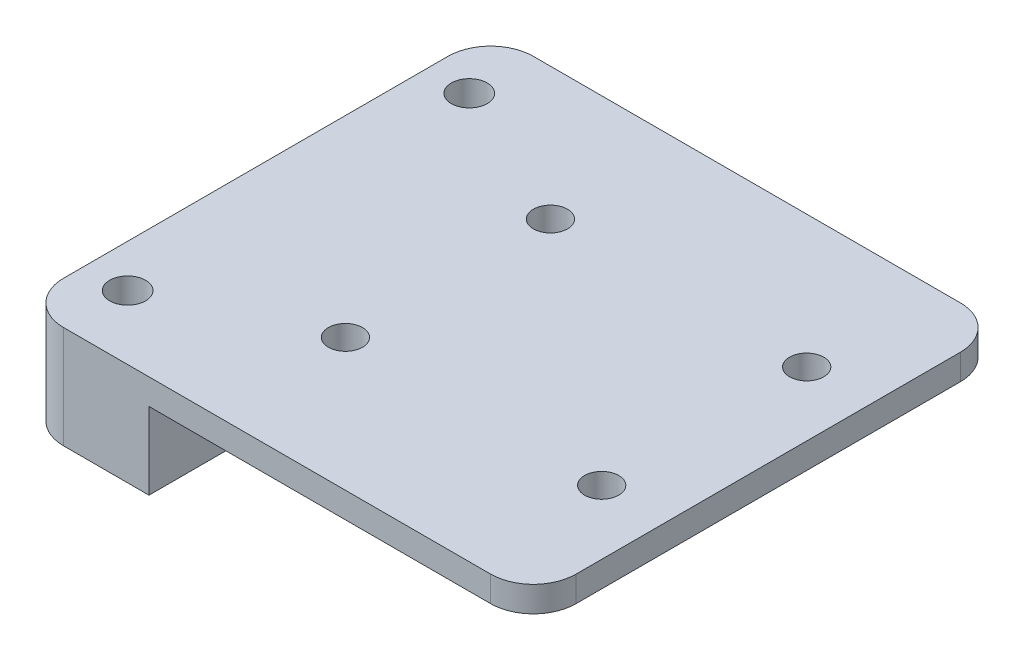
ISO-10303-21;
HEADER;
FILE_DESCRIPTION(('STEP AP214'),'2;1');
FILE_NAME('part.step','',(''),(''),'','','');
FILE_SCHEMA(('AUTOMOTIVE_DESIGN { 1 0 10303 214 1 1 1 1 }'));
ENDSEC;
DATA;
#1=APPLICATION_CONTEXT('core data for automotive mechanical design processes');
#2=APPLICATION_PROTOCOL_DEFINITION('international standard','automotive_design',2000,#1);
#3=PRODUCT_CONTEXT('',#1,'mechanical');
#4=PRODUCT('Part','Part','',(#3));
#5=PRODUCT_RELATED_PRODUCT_CATEGORY('part','',(#4));
#6=PRODUCT_DEFINITION_FORMATION('','',#4);
#7=PRODUCT_DEFINITION_CONTEXT('part definition',#1,'design');
#8=PRODUCT_DEFINITION('design','',#6,#7);
#9=PRODUCT_DEFINITION_SHAPE('','',#8);
#10=(LENGTH_UNIT() NAMED_UNIT(*) SI_UNIT(.MILLI.,.METRE.));
#11=(NAMED_UNIT(*) PLANE_ANGLE_UNIT() SI_UNIT($,.RADIAN.));
#12=(NAMED_UNIT(*) SI_UNIT($,.STERADIAN.) SOLID_ANGLE_UNIT());
#13=UNCERTAINTY_MEASURE_WITH_UNIT(LENGTH_MEASURE(1.E-05),#10,'distance_accuracy_value','');
#14=(GEOMETRIC_REPRESENTATION_CONTEXT(3) GLOBAL_UNCERTAINTY_ASSIGNED_CONTEXT((#13)) GLOBAL_UNIT_ASSIGNED_CONTEXT((#10,
#11,#12)) REPRESENTATION_CONTEXT('',''));
#15=CARTESIAN_POINT('',(0.,0.,0.));
#16=DIRECTION('',(0.,0.,1.));
#17=DIRECTION('',(1.,0.,0.));
#18=AXIS2_PLACEMENT_3D('',#15,#16,#17);
#19=CARTESIAN_POINT('',(30.,12.,27.5));
#20=DIRECTION('',(-1.,0.,0.));
#21=DIRECTION('',(0.,0.,1.));
#22=AXIS2_PLACEMENT_3D('',#19,#20,#21);
#23=PLANE('',#22);
#24=DIRECTION('',(0.,0.,1.));
#25=VECTOR('',#24,1.);
#26=CARTESIAN_POINT('',(30.,9.,27.5));
#27=LINE('',#26,#25);
#28=CARTESIAN_POINT('',(30.,9.,-22.5));
#29=VERTEX_POINT('',#28);
#30=CARTESIAN_POINT('',(30.,9.,22.5));
#31=VERTEX_POINT('',#30);
#32=EDGE_CURVE('E148',#29,#31,#27,.T.);
#33=ORIENTED_EDGE('',*,*,#32,.F.);
#34=DIRECTION('',(0.,-1.,0.));
#35=VECTOR('',#34,1.);
#36=CARTESIAN_POINT('',(30.,12.,-22.5));
#37=LINE('',#36,#35);
#38=CARTESIAN_POINT('',(30.,12.,-22.5));
#39=VERTEX_POINT('',#38);
#40=EDGE_CURVE('E193',#29,#39,#37,.F.);
#41=ORIENTED_EDGE('',*,*,#40,.T.);
#42=DIRECTION('',(0.,0.,-1.));
#43=VECTOR('',#42,1.);
#44=CARTESIAN_POINT('',(30.,12.,27.5));
#45=LINE('',#44,#43);
#46=CARTESIAN_POINT('',(30.,12.,22.5));
#47=VERTEX_POINT('',#46);
#48=EDGE_CURVE('E159',#47,#39,#45,.T.);
#49=ORIENTED_EDGE('',*,*,#48,.F.);
#50=DIRECTION('',(0.,-1.,0.));
#51=VECTOR('',#50,1.);
#52=CARTESIAN_POINT('',(30.,12.,22.5));
#53=LINE('',#52,#51);
#54=EDGE_CURVE('E190',#47,#31,#53,.T.);
#55=ORIENTED_EDGE('',*,*,#54,.T.);
#56=EDGE_LOOP('',(#33,#41,#49,#55));
#57=FACE_BOUND('',#56,.T.);
#58=ADVANCED_FACE('F44',(#57),#23,.F.);
#59=CARTESIAN_POINT('',(-30.,12.,-27.5));
#60=DIRECTION('',(0.,0.,1.));
#61=DIRECTION('',(1.,0.,0.));
#62=AXIS2_PLACEMENT_3D('',#59,#60,#61);
#63=PLANE('',#62);
#64=DIRECTION('',(-1.,0.,0.));
#65=VECTOR('',#64,1.);
#66=CARTESIAN_POINT('',(-30.,12.,-27.5));
#67=LINE('',#66,#65);
#68=CARTESIAN_POINT('',(25.,12.,-27.5));
#69=VERTEX_POINT('',#68);
#70=CARTESIAN_POINT('',(-25.,12.,-27.5));
#71=VERTEX_POINT('',#70);
#72=EDGE_CURVE('E162',#69,#71,#67,.T.);
#73=ORIENTED_EDGE('',*,*,#72,.F.);
#74=DIRECTION('',(0.,-1.,0.));
#75=VECTOR('',#74,1.);
#76=CARTESIAN_POINT('',(25.,12.,-27.5));
#77=LINE('',#76,#75);
#78=CARTESIAN_POINT('',(25.,9.,-27.5));
#79=VERTEX_POINT('',#78);
#80=EDGE_CURVE('E147',#69,#79,#77,.T.);
#81=ORIENTED_EDGE('',*,*,#80,.T.);
#82=DIRECTION('',(1.,0.,0.));
#83=VECTOR('',#82,1.);
#84=CARTESIAN_POINT('',(-15.,9.,-27.5));
#85=LINE('',#84,#83);
#86=CARTESIAN_POINT('',(-15.,9.,-27.5));
#87=VERTEX_POINT('',#86);
#88=EDGE_CURVE('E140',#87,#79,#85,.T.);
#89=ORIENTED_EDGE('',*,*,#88,.F.);
#90=DIRECTION('',(0.,-1.,0.));
#91=VECTOR('',#90,1.);
#92=CARTESIAN_POINT('',(-15.,9.,-27.5));
#93=LINE('',#92,#91);
#94=CARTESIAN_POINT('',(-15.,0.,-27.5));
#95=VERTEX_POINT('',#94);
#96=EDGE_CURVE('E122',#87,#95,#93,.T.);
#97=ORIENTED_EDGE('',*,*,#96,.T.);
#98=DIRECTION('',(-1.,0.,0.));
#99=VECTOR('',#98,1.);
#100=CARTESIAN_POINT('',(-30.,0.,-27.5));
#101=LINE('',#100,#99);
#102=CARTESIAN_POINT('',(-25.,0.,-27.5));
#103=VERTEX_POINT('',#102);
#104=EDGE_CURVE('E157',#95,#103,#101,.T.);
#105=ORIENTED_EDGE('',*,*,#104,.T.);
#106=DIRECTION('',(0.,-1.,0.));
#107=VECTOR('',#106,1.);
#108=CARTESIAN_POINT('',(-25.,12.,-27.5));
#109=LINE('',#108,#107);
#110=EDGE_CURVE('E172',#103,#71,#109,.F.);
#111=ORIENTED_EDGE('',*,*,#110,.T.);
#112=EDGE_LOOP('',(#73,#81,#89,#97,#105,#111));
#113=FACE_BOUND('',#112,.T.);
#114=ADVANCED_FACE('F145',(#113),#63,.F.);
#115=CARTESIAN_POINT('',(-30.,12.,27.5));
#116=DIRECTION('',(1.,0.,0.));
#117=DIRECTION('',(0.,0.,-1.));
#118=AXIS2_PLACEMENT_3D('',#115,#116,#117);
#119=PLANE('',#118);
#120=DIRECTION('',(0.,0.,1.));
#121=VECTOR('',#120,1.);
#122=CARTESIAN_POINT('',(-30.,12.,27.5));
#123=LINE('',#122,#121);
#124=CARTESIAN_POINT('',(-30.,12.,-22.5));
#125=VERTEX_POINT('',#124);
#126=CARTESIAN_POINT('',(-30.,12.,22.5));
#127=VERTEX_POINT('',#126);
#128=EDGE_CURVE('E166',#125,#127,#123,.T.);
#129=ORIENTED_EDGE('',*,*,#128,.F.);
#130=DIRECTION('',(0.,-1.,0.));
#131=VECTOR('',#130,1.);
#132=CARTESIAN_POINT('',(-30.,12.,-22.5));
#133=LINE('',#132,#131);
#134=CARTESIAN_POINT('',(-30.,0.,-22.5));
#135=VERTEX_POINT('',#134);
#136=EDGE_CURVE('E210',#125,#135,#133,.T.);
#137=ORIENTED_EDGE('',*,*,#136,.T.);
#138=DIRECTION('',(0.,0.,1.));
#139=VECTOR('',#138,1.);
#140=CARTESIAN_POINT('',(-30.,0.,27.5));
#141=LINE('',#140,#139);
#142=CARTESIAN_POINT('',(-30.,0.,22.5));
#143=VERTEX_POINT('',#142);
#144=EDGE_CURVE('E174',#135,#143,#141,.T.);
#145=ORIENTED_EDGE('',*,*,#144,.T.);
#146=DIRECTION('',(0.,-1.,0.));
#147=VECTOR('',#146,1.);
#148=CARTESIAN_POINT('',(-30.,12.,22.5));
#149=LINE('',#148,#147);
#150=EDGE_CURVE('E208',#143,#127,#149,.F.);
#151=ORIENTED_EDGE('',*,*,#150,.T.);
#152=EDGE_LOOP('',(#129,#137,#145,#151));
#153=FACE_BOUND('',#152,.T.);
#154=ADVANCED_FACE('F269',(#153),#119,.F.);
#155=CARTESIAN_POINT('',(-30.,12.,27.5));
#156=DIRECTION('',(0.,0.,-1.));
#157=DIRECTION('',(-1.,0.,0.));
#158=AXIS2_PLACEMENT_3D('',#155,#156,#157);
#159=PLANE('',#158);
#160=DIRECTION('',(-1.,0.,0.));
#161=VECTOR('',#160,1.);
#162=CARTESIAN_POINT('',(-15.,9.,27.5));
#163=LINE('',#162,#161);
#164=CARTESIAN_POINT('',(25.,9.,27.5));
#165=VERTEX_POINT('',#164);
#166=CARTESIAN_POINT('',(-15.,9.,27.5));
#167=VERTEX_POINT('',#166);
#168=EDGE_CURVE('E135',#165,#167,#163,.T.);
#169=ORIENTED_EDGE('',*,*,#168,.F.);
#170=DIRECTION('',(0.,-1.,0.));
#171=VECTOR('',#170,1.);
#172=CARTESIAN_POINT('',(25.,12.,27.5));
#173=LINE('',#172,#171);
#174=CARTESIAN_POINT('',(25.,12.,27.5));
#175=VERTEX_POINT('',#174);
#176=EDGE_CURVE('E206',#165,#175,#173,.F.);
#177=ORIENTED_EDGE('',*,*,#176,.T.);
#178=DIRECTION('',(1.,0.,0.));
#179=VECTOR('',#178,1.);
#180=CARTESIAN_POINT('',(-30.,12.,27.5));
#181=LINE('',#180,#179);
#182=CARTESIAN_POINT('',(-25.,12.,27.5));
#183=VERTEX_POINT('',#182);
#184=EDGE_CURVE('E169',#183,#175,#181,.T.);
#185=ORIENTED_EDGE('',*,*,#184,.F.);
#186=DIRECTION('',(0.,-1.,0.));
#187=VECTOR('',#186,1.);
#188=CARTESIAN_POINT('',(-25.,12.,27.5));
#189=LINE('',#188,#187);
#190=CARTESIAN_POINT('',(-25.,0.,27.5));
#191=VERTEX_POINT('',#190);
#192=EDGE_CURVE('E203',#183,#191,#189,.T.);
#193=ORIENTED_EDGE('',*,*,#192,.T.);
#194=DIRECTION('',(1.,0.,0.));
#195=VECTOR('',#194,1.);
#196=CARTESIAN_POINT('',(-30.,0.,27.5));
#197=LINE('',#196,#195);
#198=CARTESIAN_POINT('',(-15.,0.,27.5));
#199=VERTEX_POINT('',#198);
#200=EDGE_CURVE('E163',#191,#199,#197,.T.);
#201=ORIENTED_EDGE('',*,*,#200,.T.);
#202=DIRECTION('',(0.,-1.,0.));
#203=VECTOR('',#202,1.);
#204=CARTESIAN_POINT('',(-15.,9.,27.5));
#205=LINE('',#204,#203);
#206=EDGE_CURVE('E134',#167,#199,#205,.T.);
#207=ORIENTED_EDGE('',*,*,#206,.F.);
#208=EDGE_LOOP('',(#169,#177,#185,#193,#201,#207));
#209=FACE_BOUND('',#208,.T.);
#210=ADVANCED_FACE('F247',(#209),#159,.F.);
#211=CARTESIAN_POINT('',(0.,12.,0.));
#212=DIRECTION('',(0.,-1.,0.));
#213=DIRECTION('',(0.,0.,-1.));
#214=AXIS2_PLACEMENT_3D('',#211,#212,#213);
#215=PLANE('',#214);
#216=CARTESIAN_POINT('',(-7.5,12.,-12.));
#217=DIRECTION('',(0.,1.,0.));
#218=DIRECTION('',(0.,0.,1.));
#219=AXIS2_PLACEMENT_3D('',#216,#217,#218);
#220=CIRCLE('',#219,1.99999999999999);
#221=CARTESIAN_POINT('',(-7.5,12.,-10.));
#222=VERTEX_POINT('',#221);
#223=EDGE_CURVE('E230',#222,#222,#220,.T.);
#224=ORIENTED_EDGE('',*,*,#223,.F.);
#225=EDGE_LOOP('',(#224));
#226=FACE_BOUND('',#225,.T.);
#227=CARTESIAN_POINT('',(-7.5,12.,12.));
#228=DIRECTION('',(0.,1.,0.));
#229=DIRECTION('',(0.,0.,1.));
#230=AXIS2_PLACEMENT_3D('',#227,#228,#229);
#231=CIRCLE('',#230,1.99999999999999);
#232=CARTESIAN_POINT('',(-7.5,12.,14.));
#233=VERTEX_POINT('',#232);
#234=EDGE_CURVE('E219',#233,#233,#231,.T.);
#235=ORIENTED_EDGE('',*,*,#234,.F.);
#236=EDGE_LOOP('',(#235));
#237=FACE_BOUND('',#236,.T.);
#238=CARTESIAN_POINT('',(22.5,12.,12.));
#239=DIRECTION('',(0.,1.,0.));
#240=DIRECTION('',(0.,0.,1.));
#241=AXIS2_PLACEMENT_3D('',#238,#239,#240);
#242=CIRCLE('',#241,1.99999999999999);
#243=CARTESIAN_POINT('',(22.5,12.,14.));
#244=VERTEX_POINT('',#243);
#245=EDGE_CURVE('E218',#244,#244,#242,.T.);
#246=ORIENTED_EDGE('',*,*,#245,.F.);
#247=EDGE_LOOP('',(#246));
#248=FACE_BOUND('',#247,.T.);
#249=CARTESIAN_POINT('',(22.5,12.,-12.));
#250=DIRECTION('',(0.,1.,0.));
#251=DIRECTION('',(0.,0.,1.));
#252=AXIS2_PLACEMENT_3D('',#249,#250,#251);
#253=CIRCLE('',#252,1.99999999999999);
#254=CARTESIAN_POINT('',(22.5,12.,-10.));
#255=VERTEX_POINT('',#254);
#256=EDGE_CURVE('E215',#255,#255,#253,.T.);
#257=ORIENTED_EDGE('',*,*,#256,.F.);
#258=EDGE_LOOP('',(#257));
#259=FACE_BOUND('',#258,.T.);
#260=CARTESIAN_POINT('',(-25.,12.,-20.));
#261=DIRECTION('',(0.,1.,0.));
#262=DIRECTION('',(0.,0.,1.));
#263=AXIS2_PLACEMENT_3D('',#260,#261,#262);
#264=CIRCLE('',#263,2.1);
#265=CARTESIAN_POINT('',(-25.,12.,-17.9));
#266=VERTEX_POINT('',#265);
#267=EDGE_CURVE('E183',#266,#266,#264,.T.);
#268=ORIENTED_EDGE('',*,*,#267,.F.);
#269=EDGE_LOOP('',(#268));
#270=FACE_BOUND('',#269,.T.);
#271=CARTESIAN_POINT('',(-25.,12.,20.));
#272=DIRECTION('',(0.,1.,0.));
#273=DIRECTION('',(0.,0.,1.));
#274=AXIS2_PLACEMENT_3D('',#271,#272,#273);
#275=CIRCLE('',#274,2.1);
#276=CARTESIAN_POINT('',(-25.,12.,22.1));
#277=VERTEX_POINT('',#276);
#278=EDGE_CURVE('E179',#277,#277,#275,.T.);
#279=ORIENTED_EDGE('',*,*,#278,.F.);
#280=EDGE_LOOP('',(#279));
#281=FACE_BOUND('',#280,.T.);
#282=ORIENTED_EDGE('',*,*,#48,.T.);
#283=CARTESIAN_POINT('',(25.,12.,-22.5));
#284=DIRECTION('',(0.,-1.,0.));
#285=DIRECTION('',(0.,0.,-1.));
#286=AXIS2_PLACEMENT_3D('',#283,#284,#285);
#287=CIRCLE('',#286,5.);
#288=EDGE_CURVE('E201',#39,#69,#287,.F.);
#289=ORIENTED_EDGE('',*,*,#288,.T.);
#290=ORIENTED_EDGE('',*,*,#72,.T.);
#291=CARTESIAN_POINT('',(-25.,12.,-22.5));
#292=DIRECTION('',(0.,-1.,0.));
#293=DIRECTION('',(0.,0.,-1.));
#294=AXIS2_PLACEMENT_3D('',#291,#292,#293);
#295=CIRCLE('',#294,5.);
#296=EDGE_CURVE('E197',#71,#125,#295,.F.);
#297=ORIENTED_EDGE('',*,*,#296,.T.);
#298=ORIENTED_EDGE('',*,*,#128,.T.);
#299=CARTESIAN_POINT('',(-25.,12.,22.5));
#300=DIRECTION('',(0.,-1.,0.));
#301=DIRECTION('',(0.,0.,-1.));
#302=AXIS2_PLACEMENT_3D('',#299,#300,#301);
#303=CIRCLE('',#302,5.);
#304=EDGE_CURVE('E195',#127,#183,#303,.F.);
#305=ORIENTED_EDGE('',*,*,#304,.T.);
#306=ORIENTED_EDGE('',*,*,#184,.T.);
#307=CARTESIAN_POINT('',(25.,12.,22.5));
#308=DIRECTION('',(0.,-1.,0.));
#309=DIRECTION('',(0.,0.,-1.));
#310=AXIS2_PLACEMENT_3D('',#307,#308,#309);
#311=CIRCLE('',#310,5.);
#312=EDGE_CURVE('E199',#175,#47,#311,.F.);
#313=ORIENTED_EDGE('',*,*,#312,.T.);
#314=EDGE_LOOP('',(#282,#289,#290,#297,#298,#305,#306,#313));
#315=FACE_BOUND('',#314,.T.);
#316=ADVANCED_FACE('F243',(#226,#237,#248,#259,#270,#281,#315),#215,.F.);
#317=CARTESIAN_POINT('',(0.,0.,0.));
#318=DIRECTION('',(0.,-1.,0.));
#319=DIRECTION('',(0.,0.,-1.));
#320=AXIS2_PLACEMENT_3D('',#317,#318,#319);
#321=PLANE('',#320);
#322=CARTESIAN_POINT('',(-25.,0.,-20.));
#323=DIRECTION('',(0.,-1.,0.));
#324=DIRECTION('',(0.,0.,-1.));
#325=AXIS2_PLACEMENT_3D('',#322,#323,#324);
#326=CIRCLE('',#325,2.1);
#327=CARTESIAN_POINT('',(-25.,0.,-22.1));
#328=VERTEX_POINT('',#327);
#329=EDGE_CURVE('E180',#328,#328,#326,.T.);
#330=ORIENTED_EDGE('',*,*,#329,.F.);
#331=EDGE_LOOP('',(#330));
#332=FACE_BOUND('',#331,.T.);
#333=CARTESIAN_POINT('',(-25.,0.,20.));
#334=DIRECTION('',(0.,-1.,0.));
#335=DIRECTION('',(0.,0.,-1.));
#336=AXIS2_PLACEMENT_3D('',#333,#334,#335);
#337=CIRCLE('',#336,2.1);
#338=CARTESIAN_POINT('',(-25.,0.,17.9));
#339=VERTEX_POINT('',#338);
#340=EDGE_CURVE('E156',#339,#339,#337,.T.);
#341=ORIENTED_EDGE('',*,*,#340,.F.);
#342=EDGE_LOOP('',(#341));
#343=FACE_BOUND('',#342,.T.);
#344=ORIENTED_EDGE('',*,*,#144,.F.);
#345=CARTESIAN_POINT('',(-25.,0.,-22.5));
#346=DIRECTION('',(0.,-1.,0.));
#347=DIRECTION('',(0.,0.,-1.));
#348=AXIS2_PLACEMENT_3D('',#345,#346,#347);
#349=CIRCLE('',#348,5.);
#350=EDGE_CURVE('E11',#135,#103,#349,.T.);
#351=ORIENTED_EDGE('',*,*,#350,.T.);
#352=ORIENTED_EDGE('',*,*,#104,.F.);
#353=DIRECTION('',(0.,0.,-1.));
#354=VECTOR('',#353,1.);
#355=CARTESIAN_POINT('',(-15.,0.,27.5));
#356=LINE('',#355,#354);
#357=EDGE_CURVE('E129',#199,#95,#356,.T.);
#358=ORIENTED_EDGE('',*,*,#357,.F.);
#359=ORIENTED_EDGE('',*,*,#200,.F.);
#360=CARTESIAN_POINT('',(-25.,0.,22.5));
#361=DIRECTION('',(0.,-1.,0.));
#362=DIRECTION('',(0.,0.,-1.));
#363=AXIS2_PLACEMENT_3D('',#360,#361,#362);
#364=CIRCLE('',#363,5.);
#365=EDGE_CURVE('E53',#191,#143,#364,.T.);
#366=ORIENTED_EDGE('',*,*,#365,.T.);
#367=EDGE_LOOP('',(#344,#351,#352,#358,#359,#366));
#368=FACE_BOUND('',#367,.T.);
#369=ADVANCED_FACE('F246',(#332,#343,#368),#321,.T.);
#370=CARTESIAN_POINT('',(-15.,9.,27.5));
#371=DIRECTION('',(-1.,0.,0.));
#372=DIRECTION('',(0.,0.,1.));
#373=AXIS2_PLACEMENT_3D('',#370,#371,#372);
#374=PLANE('',#373);
#375=ORIENTED_EDGE('',*,*,#357,.T.);
#376=ORIENTED_EDGE('',*,*,#96,.F.);
#377=DIRECTION('',(0.,0.,-1.));
#378=VECTOR('',#377,1.);
#379=CARTESIAN_POINT('',(-15.,9.,27.5));
#380=LINE('',#379,#378);
#381=EDGE_CURVE('E126',#167,#87,#380,.T.);
#382=ORIENTED_EDGE('',*,*,#381,.F.);
#383=ORIENTED_EDGE('',*,*,#206,.T.);
#384=EDGE_LOOP('',(#375,#376,#382,#383));
#385=FACE_BOUND('',#384,.T.);
#386=ADVANCED_FACE('F124',(#385),#374,.F.);
#387=CARTESIAN_POINT('',(0.,9.,0.));
#388=DIRECTION('',(0.,-1.,0.));
#389=DIRECTION('',(0.,0.,-1.));
#390=AXIS2_PLACEMENT_3D('',#387,#388,#389);
#391=PLANE('',#390);
#392=CARTESIAN_POINT('',(-7.5,9.,-12.));
#393=DIRECTION('',(0.,-1.,0.));
#394=DIRECTION('',(0.,0.,-1.));
#395=AXIS2_PLACEMENT_3D('',#392,#393,#394);
#396=CIRCLE('',#395,1.99999999999999);
#397=CARTESIAN_POINT('',(-7.5,9.,-14.));
#398=VERTEX_POINT('',#397);
#399=EDGE_CURVE('E48',#398,#398,#396,.T.);
#400=ORIENTED_EDGE('',*,*,#399,.F.);
#401=EDGE_LOOP('',(#400));
#402=FACE_BOUND('',#401,.T.);
#403=CARTESIAN_POINT('',(-7.5,9.,12.));
#404=DIRECTION('',(0.,-1.,0.));
#405=DIRECTION('',(0.,0.,-1.));
#406=AXIS2_PLACEMENT_3D('',#403,#404,#405);
#407=CIRCLE('',#406,1.99999999999999);
#408=CARTESIAN_POINT('',(-7.5,9.,10.));
#409=VERTEX_POINT('',#408);
#410=EDGE_CURVE('E216',#409,#409,#407,.T.);
#411=ORIENTED_EDGE('',*,*,#410,.F.);
#412=EDGE_LOOP('',(#411));
#413=FACE_BOUND('',#412,.T.);
#414=CARTESIAN_POINT('',(22.5,9.,12.));
#415=DIRECTION('',(0.,-1.,0.));
#416=DIRECTION('',(0.,0.,-1.));
#417=AXIS2_PLACEMENT_3D('',#414,#415,#416);
#418=CIRCLE('',#417,1.99999999999999);
#419=CARTESIAN_POINT('',(22.5,9.,10.));
#420=VERTEX_POINT('',#419);
#421=EDGE_CURVE('E223',#420,#420,#418,.T.);
#422=ORIENTED_EDGE('',*,*,#421,.F.);
#423=EDGE_LOOP('',(#422));
#424=FACE_BOUND('',#423,.T.);
#425=CARTESIAN_POINT('',(22.5,9.,-12.));
#426=DIRECTION('',(0.,-1.,0.));
#427=DIRECTION('',(0.,0.,-1.));
#428=AXIS2_PLACEMENT_3D('',#425,#426,#427);
#429=CIRCLE('',#428,1.99999999999999);
#430=CARTESIAN_POINT('',(22.5,9.,-14.));
#431=VERTEX_POINT('',#430);
#432=EDGE_CURVE('E213',#431,#431,#429,.T.);
#433=ORIENTED_EDGE('',*,*,#432,.F.);
#434=EDGE_LOOP('',(#433));
#435=FACE_BOUND('',#434,.T.);
#436=ORIENTED_EDGE('',*,*,#88,.T.);
#437=CARTESIAN_POINT('',(25.,9.,-22.5));
#438=DIRECTION('',(0.,-1.,0.));
#439=DIRECTION('',(0.,0.,-1.));
#440=AXIS2_PLACEMENT_3D('',#437,#438,#439);
#441=CIRCLE('',#440,5.);
#442=EDGE_CURVE('E188',#79,#29,#441,.T.);
#443=ORIENTED_EDGE('',*,*,#442,.T.);
#444=ORIENTED_EDGE('',*,*,#32,.T.);
#445=CARTESIAN_POINT('',(25.,9.,22.5));
#446=DIRECTION('',(0.,-1.,0.));
#447=DIRECTION('',(0.,0.,-1.));
#448=AXIS2_PLACEMENT_3D('',#445,#446,#447);
#449=CIRCLE('',#448,5.);
#450=EDGE_CURVE('E186',#31,#165,#449,.T.);
#451=ORIENTED_EDGE('',*,*,#450,.T.);
#452=ORIENTED_EDGE('',*,*,#168,.T.);
#453=ORIENTED_EDGE('',*,*,#381,.T.);
#454=EDGE_LOOP('',(#436,#443,#444,#451,#452,#453));
#455=FACE_BOUND('',#454,.T.);
#456=ADVANCED_FACE('F139',(#402,#413,#424,#435,#455),#391,.T.);
#457=CARTESIAN_POINT('',(-25.,12.,20.));
#458=DIRECTION('',(0.,1.,0.));
#459=DIRECTION('',(0.,0.,1.));
#460=AXIS2_PLACEMENT_3D('',#457,#458,#459);
#461=CYLINDRICAL_SURFACE('',#460,2.1);
#462=ORIENTED_EDGE('',*,*,#340,.T.);
#463=EDGE_LOOP('',(#462));
#464=FACE_BOUND('',#463,.T.);
#465=ORIENTED_EDGE('',*,*,#278,.T.);
#466=EDGE_LOOP('',(#465));
#467=FACE_BOUND('',#466,.T.);
#468=ADVANCED_FACE('F241',(#464,#467),#461,.F.);
#469=CARTESIAN_POINT('',(-25.,12.,-20.));
#470=DIRECTION('',(0.,1.,0.));
#471=DIRECTION('',(0.,0.,1.));
#472=AXIS2_PLACEMENT_3D('',#469,#470,#471);
#473=CYLINDRICAL_SURFACE('',#472,2.1);
#474=ORIENTED_EDGE('',*,*,#329,.T.);
#475=EDGE_LOOP('',(#474));
#476=FACE_BOUND('',#475,.T.);
#477=ORIENTED_EDGE('',*,*,#267,.T.);
#478=EDGE_LOOP('',(#477));
#479=FACE_BOUND('',#478,.T.);
#480=ADVANCED_FACE('F292',(#476,#479),#473,.F.);
#481=CARTESIAN_POINT('',(25.,12.,-22.5));
#482=DIRECTION('',(0.,-1.,0.));
#483=DIRECTION('',(0.,0.,-1.));
#484=AXIS2_PLACEMENT_3D('',#481,#482,#483);
#485=CYLINDRICAL_SURFACE('',#484,5.);
#486=ORIENTED_EDGE('',*,*,#288,.F.);
#487=ORIENTED_EDGE('',*,*,#40,.F.);
#488=ORIENTED_EDGE('',*,*,#442,.F.);
#489=ORIENTED_EDGE('',*,*,#80,.F.);
#490=EDGE_LOOP('',(#486,#487,#488,#489));
#491=FACE_BOUND('',#490,.T.);
#492=ADVANCED_FACE('F257',(#491),#485,.T.);
#493=CARTESIAN_POINT('',(25.,12.,22.5));
#494=DIRECTION('',(0.,-1.,0.));
#495=DIRECTION('',(0.,0.,-1.));
#496=AXIS2_PLACEMENT_3D('',#493,#494,#495);
#497=CYLINDRICAL_SURFACE('',#496,5.);
#498=ORIENTED_EDGE('',*,*,#312,.F.);
#499=ORIENTED_EDGE('',*,*,#176,.F.);
#500=ORIENTED_EDGE('',*,*,#450,.F.);
#501=ORIENTED_EDGE('',*,*,#54,.F.);
#502=EDGE_LOOP('',(#498,#499,#500,#501));
#503=FACE_BOUND('',#502,.T.);
#504=ADVANCED_FACE('F260',(#503),#497,.T.);
#505=CARTESIAN_POINT('',(-25.,12.,-22.5));
#506=DIRECTION('',(0.,-1.,0.));
#507=DIRECTION('',(0.,0.,-1.));
#508=AXIS2_PLACEMENT_3D('',#505,#506,#507);
#509=CYLINDRICAL_SURFACE('',#508,5.);
#510=ORIENTED_EDGE('',*,*,#296,.F.);
#511=ORIENTED_EDGE('',*,*,#110,.F.);
#512=ORIENTED_EDGE('',*,*,#350,.F.);
#513=ORIENTED_EDGE('',*,*,#136,.F.);
#514=EDGE_LOOP('',(#510,#511,#512,#513));
#515=FACE_BOUND('',#514,.T.);
#516=ADVANCED_FACE('F265',(#515),#509,.T.);
#517=CARTESIAN_POINT('',(-25.,12.,22.5));
#518=DIRECTION('',(0.,-1.,0.));
#519=DIRECTION('',(0.,0.,-1.));
#520=AXIS2_PLACEMENT_3D('',#517,#518,#519);
#521=CYLINDRICAL_SURFACE('',#520,5.);
#522=ORIENTED_EDGE('',*,*,#304,.F.);
#523=ORIENTED_EDGE('',*,*,#150,.F.);
#524=ORIENTED_EDGE('',*,*,#365,.F.);
#525=ORIENTED_EDGE('',*,*,#192,.F.);
#526=EDGE_LOOP('',(#522,#523,#524,#525));
#527=FACE_BOUND('',#526,.T.);
#528=ADVANCED_FACE('F46',(#527),#521,.T.);
#529=CARTESIAN_POINT('',(22.5,12.,-12.));
#530=DIRECTION('',(0.,1.,0.));
#531=DIRECTION('',(0.,0.,1.));
#532=AXIS2_PLACEMENT_3D('',#529,#530,#531);
#533=CYLINDRICAL_SURFACE('',#532,1.99999999999999);
#534=ORIENTED_EDGE('',*,*,#432,.T.);
#535=EDGE_LOOP('',(#534));
#536=FACE_BOUND('',#535,.T.);
#537=ORIENTED_EDGE('',*,*,#256,.T.);
#538=EDGE_LOOP('',(#537));
#539=FACE_BOUND('',#538,.T.);
#540=ADVANCED_FACE('F274',(#536,#539),#533,.F.);
#541=CARTESIAN_POINT('',(22.5,12.,12.));
#542=DIRECTION('',(0.,1.,0.));
#543=DIRECTION('',(0.,0.,1.));
#544=AXIS2_PLACEMENT_3D('',#541,#542,#543);
#545=CYLINDRICAL_SURFACE('',#544,1.99999999999999);
#546=ORIENTED_EDGE('',*,*,#421,.T.);
#547=EDGE_LOOP('',(#546));
#548=FACE_BOUND('',#547,.T.);
#549=ORIENTED_EDGE('',*,*,#245,.T.);
#550=EDGE_LOOP('',(#549));
#551=FACE_BOUND('',#550,.T.);
#552=ADVANCED_FACE('F279',(#548,#551),#545,.F.);
#553=CARTESIAN_POINT('',(-7.5,12.,12.));
#554=DIRECTION('',(0.,1.,0.));
#555=DIRECTION('',(0.,0.,1.));
#556=AXIS2_PLACEMENT_3D('',#553,#554,#555);
#557=CYLINDRICAL_SURFACE('',#556,1.99999999999999);
#558=ORIENTED_EDGE('',*,*,#410,.T.);
#559=EDGE_LOOP('',(#558));
#560=FACE_BOUND('',#559,.T.);
#561=ORIENTED_EDGE('',*,*,#234,.T.);
#562=EDGE_LOOP('',(#561));
#563=FACE_BOUND('',#562,.T.);
#564=ADVANCED_FACE('F349',(#560,#563),#557,.F.);
#565=CARTESIAN_POINT('',(-7.5,12.,-12.));
#566=DIRECTION('',(0.,1.,0.));
#567=DIRECTION('',(0.,0.,1.));
#568=AXIS2_PLACEMENT_3D('',#565,#566,#567);
#569=CYLINDRICAL_SURFACE('',#568,1.99999999999999);
#570=ORIENTED_EDGE('',*,*,#399,.T.);
#571=EDGE_LOOP('',(#570));
#572=FACE_BOUND('',#571,.T.);
#573=ORIENTED_EDGE('',*,*,#223,.T.);
#574=EDGE_LOOP('',(#573));
#575=FACE_BOUND('',#574,.T.);
#576=ADVANCED_FACE('F360',(#572,#575),#569,.F.);
#577=CLOSED_SHELL('',(#58,#114,#154,#210,#316,#369,#386,#456,#468,#480,#492,#504,#516,#528,#540,
#552,#564,#576));
#578=MANIFOLD_SOLID_BREP('B2',#577);
#579=ADVANCED_BREP_SHAPE_REPRESENTATION('',(#18,#578),#14);
#580=SHAPE_DEFINITION_REPRESENTATION(#9,#579);
ENDSEC;
END-ISO-10303-21;
